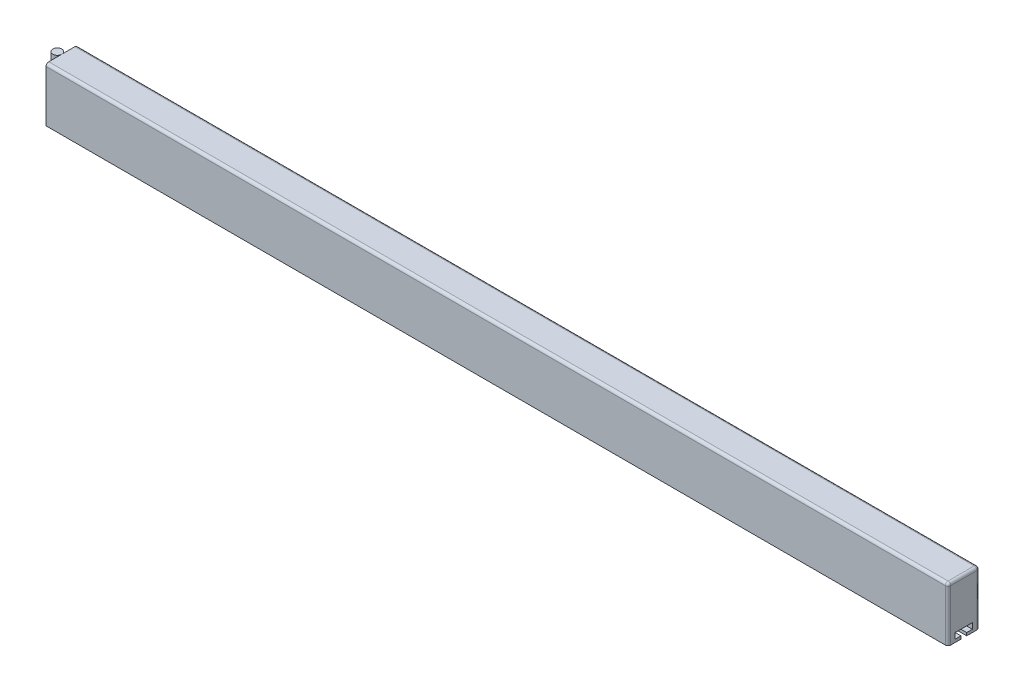
ISO-10303-21;
HEADER;
FILE_DESCRIPTION(('STEP AP214'),'2;1');
FILE_NAME('part.step','',(''),(''),'','','');
FILE_SCHEMA(('AUTOMOTIVE_DESIGN { 1 0 10303 214 1 1 1 1 }'));
ENDSEC;
DATA;
#1=APPLICATION_CONTEXT('core data for automotive mechanical design processes');
#2=APPLICATION_PROTOCOL_DEFINITION('international standard','automotive_design',2000,#1);
#3=PRODUCT_CONTEXT('',#1,'mechanical');
#4=PRODUCT('Part','Part','',(#3));
#5=PRODUCT_RELATED_PRODUCT_CATEGORY('part','',(#4));
#6=PRODUCT_DEFINITION_FORMATION('','',#4);
#7=PRODUCT_DEFINITION_CONTEXT('part definition',#1,'design');
#8=PRODUCT_DEFINITION('design','',#6,#7);
#9=PRODUCT_DEFINITION_SHAPE('','',#8);
#10=(LENGTH_UNIT() NAMED_UNIT(*) SI_UNIT(.MILLI.,.METRE.));
#11=(NAMED_UNIT(*) PLANE_ANGLE_UNIT() SI_UNIT($,.RADIAN.));
#12=(NAMED_UNIT(*) SI_UNIT($,.STERADIAN.) SOLID_ANGLE_UNIT());
#13=UNCERTAINTY_MEASURE_WITH_UNIT(LENGTH_MEASURE(1.E-05),#10,'distance_accuracy_value','');
#14=(GEOMETRIC_REPRESENTATION_CONTEXT(3) GLOBAL_UNCERTAINTY_ASSIGNED_CONTEXT((#13)) GLOBAL_UNIT_ASSIGNED_CONTEXT((#10,
#11,#12)) REPRESENTATION_CONTEXT('',''));
#15=CARTESIAN_POINT('',(0.,0.,0.));
#16=DIRECTION('',(0.,0.,1.));
#17=DIRECTION('',(1.,0.,0.));
#18=AXIS2_PLACEMENT_3D('',#15,#16,#17);
#19=CARTESIAN_POINT('',(-1010.,-88.284271247462,35.));
#20=DIRECTION('',(0.,1.,0.));
#21=DIRECTION('',(0.,0.,1.));
#22=AXIS2_PLACEMENT_3D('',#19,#20,#21);
#23=CYLINDRICAL_SURFACE('',#22,10.0000000000001);
#24=CARTESIAN_POINT('',(-1010.,-60.,35.));
#25=DIRECTION('',(0.,1.,0.));
#26=DIRECTION('',(0.,0.,1.));
#27=AXIS2_PLACEMENT_3D('',#24,#25,#26);
#28=CIRCLE('',#27,10.0000000000001);
#29=CARTESIAN_POINT('',(-1010.,-60.,45.0000000000001));
#30=VERTEX_POINT('',#29);
#31=EDGE_CURVE('E11',#30,#30,#28,.F.);
#32=ORIENTED_EDGE('',*,*,#31,.F.);
#33=EDGE_LOOP('',(#32));
#34=FACE_BOUND('',#33,.T.);
#35=CARTESIAN_POINT('',(-1010.,60.,35.));
#36=DIRECTION('',(0.,1.,0.));
#37=DIRECTION('',(0.,0.,1.));
#38=AXIS2_PLACEMENT_3D('',#35,#36,#37);
#39=CIRCLE('',#38,10.0000000000001);
#40=CARTESIAN_POINT('',(-1010.,60.,45.0000000000001));
#41=VERTEX_POINT('',#40);
#42=EDGE_CURVE('E48',#41,#41,#39,.T.);
#43=ORIENTED_EDGE('',*,*,#42,.F.);
#44=EDGE_LOOP('',(#43));
#45=FACE_BOUND('',#44,.T.);
#46=ADVANCED_FACE('F42',(#34,#45),#23,.T.);
#47=CARTESIAN_POINT('',(-1010.,60.,35.));
#48=DIRECTION('',(0.,1.,0.));
#49=DIRECTION('',(0.,0.,1.));
#50=AXIS2_PLACEMENT_3D('',#47,#48,#49);
#51=PLANE('',#50);
#52=ORIENTED_EDGE('',*,*,#42,.T.);
#53=EDGE_LOOP('',(#52));
#54=FACE_BOUND('',#53,.T.);
#55=ADVANCED_FACE('F54',(#54),#51,.T.);
#56=CARTESIAN_POINT('',(-1000.,-60.,70.));
#57=DIRECTION('',(0.,1.,0.));
#58=DIRECTION('',(0.,0.,1.));
#59=AXIS2_PLACEMENT_3D('',#56,#57,#58);
#60=PLANE('',#59);
#61=ORIENTED_EDGE('',*,*,#31,.T.);
#62=EDGE_LOOP('',(#61));
#63=FACE_BOUND('',#62,.T.);
#64=ADVANCED_FACE('F61',(#63),#60,.F.);
#65=CLOSED_SHELL('',(#46,#55,#64));
#66=MANIFOLD_SOLID_BREP('B2',#65);
#67=CARTESIAN_POINT('',(-1000.,-60.,70.));
#68=DIRECTION('',(0.,1.,0.));
#69=DIRECTION('',(0.,0.,1.));
#70=AXIS2_PLACEMENT_3D('',#67,#68,#69);
#71=PLANE('',#70);
#72=DIRECTION('',(0.,0.,-1.));
#73=VECTOR('',#72,1.);
#74=CARTESIAN_POINT('',(1000.,-60.,70.));
#75=LINE('',#74,#73);
#76=CARTESIAN_POINT('',(1000.,-60.,64.));
#77=VERTEX_POINT('',#76);
#78=CARTESIAN_POINT('',(1000.,-60.,41.35));
#79=VERTEX_POINT('',#78);
#80=EDGE_CURVE('E222',#77,#79,#75,.T.);
#81=ORIENTED_EDGE('',*,*,#80,.F.);
#82=CARTESIAN_POINT('',(994.,-60.,64.));
#83=DIRECTION('',(0.,1.,0.));
#84=DIRECTION('',(0.,0.,1.));
#85=AXIS2_PLACEMENT_3D('',#82,#83,#84);
#86=CIRCLE('',#85,6.);
#87=CARTESIAN_POINT('',(994.,-60.,70.));
#88=VERTEX_POINT('',#87);
#89=EDGE_CURVE('E40',#77,#88,#86,.F.);
#90=ORIENTED_EDGE('',*,*,#89,.T.);
#91=DIRECTION('',(1.,0.,0.));
#92=VECTOR('',#91,1.);
#93=CARTESIAN_POINT('',(-1000.,-60.,70.));
#94=LINE('',#93,#92);
#95=CARTESIAN_POINT('',(-1000.,-60.,70.));
#96=VERTEX_POINT('',#95);
#97=EDGE_CURVE('E223',#96,#88,#94,.T.);
#98=ORIENTED_EDGE('',*,*,#97,.F.);
#99=DIRECTION('',(0.,0.,-1.));
#100=VECTOR('',#99,1.);
#101=CARTESIAN_POINT('',(-1000.,-60.,70.));
#102=LINE('',#101,#100);
#103=CARTESIAN_POINT('',(-1000.,-60.,41.35));
#104=VERTEX_POINT('',#103);
#105=EDGE_CURVE('E232',#96,#104,#102,.T.);
#106=ORIENTED_EDGE('',*,*,#105,.T.);
#107=DIRECTION('',(1.,0.,0.));
#108=VECTOR('',#107,1.);
#109=CARTESIAN_POINT('',(-1042.59709497137,-60.,41.35));
#110=LINE('',#109,#108);
#111=EDGE_CURVE('E288',#104,#79,#110,.T.);
#112=ORIENTED_EDGE('',*,*,#111,.T.);
#113=EDGE_LOOP('',(#81,#90,#98,#106,#112));
#114=FACE_BOUND('',#113,.T.);
#115=ADVANCED_FACE('F79',(#114),#71,.F.);
#116=CARTESIAN_POINT('',(1000.,-60.,70.));
#117=DIRECTION('',(-1.,0.,0.));
#118=DIRECTION('',(0.,0.,1.));
#119=AXIS2_PLACEMENT_3D('',#116,#117,#118);
#120=PLANE('',#119);
#121=CARTESIAN_POINT('',(1000.,-60.,28.65));
#122=VERTEX_POINT('',#121);
#123=CARTESIAN_POINT('',(1000.,-60.,6.00000000000001));
#124=VERTEX_POINT('',#123);
#125=EDGE_CURVE('E212',#122,#124,#75,.T.);
#126=ORIENTED_EDGE('',*,*,#125,.T.);
#127=DIRECTION('',(0.,1.,0.));
#128=VECTOR('',#127,1.);
#129=CARTESIAN_POINT('',(1000.,54.,6.00000000000001));
#130=LINE('',#129,#128);
#131=CARTESIAN_POINT('',(1000.,54.,6.00000000000001));
#132=VERTEX_POINT('',#131);
#133=EDGE_CURVE('E256',#124,#132,#130,.T.);
#134=ORIENTED_EDGE('',*,*,#133,.T.);
#135=DIRECTION('',(0.,0.,-1.));
#136=VECTOR('',#135,1.);
#137=CARTESIAN_POINT('',(1000.,54.,70.));
#138=LINE('',#137,#136);
#139=CARTESIAN_POINT('',(1000.,54.,64.));
#140=VERTEX_POINT('',#139);
#141=EDGE_CURVE('E254',#132,#140,#138,.F.);
#142=ORIENTED_EDGE('',*,*,#141,.T.);
#143=DIRECTION('',(0.,1.,0.));
#144=VECTOR('',#143,1.);
#145=CARTESIAN_POINT('',(1000.,-60.,64.));
#146=LINE('',#145,#144);
#147=EDGE_CURVE('E252',#140,#77,#146,.F.);
#148=ORIENTED_EDGE('',*,*,#147,.T.);
#149=ORIENTED_EDGE('',*,*,#80,.T.);
#150=DIRECTION('',(0.,-1.,0.));
#151=VECTOR('',#150,1.);
#152=CARTESIAN_POINT('',(1000.,-60.,41.35));
#153=LINE('',#152,#151);
#154=CARTESIAN_POINT('',(1000.,-53.65,41.35));
#155=VERTEX_POINT('',#154);
#156=EDGE_CURVE('E206',#155,#79,#153,.T.);
#157=ORIENTED_EDGE('',*,*,#156,.F.);
#158=DIRECTION('',(0.,0.,-1.));
#159=VECTOR('',#158,1.);
#160=CARTESIAN_POINT('',(1000.,-53.65,41.35));
#161=LINE('',#160,#159);
#162=CARTESIAN_POINT('',(1000.,-53.65,54.05));
#163=VERTEX_POINT('',#162);
#164=EDGE_CURVE('E535',#163,#155,#161,.T.);
#165=ORIENTED_EDGE('',*,*,#164,.F.);
#166=DIRECTION('',(0.,-1.,0.));
#167=VECTOR('',#166,1.);
#168=CARTESIAN_POINT('',(1000.,-53.65,54.05));
#169=LINE('',#168,#167);
#170=CARTESIAN_POINT('',(1000.,-40.95,54.05));
#171=VERTEX_POINT('',#170);
#172=EDGE_CURVE('E533',#171,#163,#169,.T.);
#173=ORIENTED_EDGE('',*,*,#172,.F.);
#174=DIRECTION('',(0.,0.,1.));
#175=VECTOR('',#174,1.);
#176=CARTESIAN_POINT('',(1000.,-40.95,54.05));
#177=LINE('',#176,#175);
#178=CARTESIAN_POINT('',(1000.,-40.95,15.95));
#179=VERTEX_POINT('',#178);
#180=EDGE_CURVE('E530',#179,#171,#177,.T.);
#181=ORIENTED_EDGE('',*,*,#180,.F.);
#182=DIRECTION('',(0.,1.,0.));
#183=VECTOR('',#182,1.);
#184=CARTESIAN_POINT('',(1000.,-53.65,15.95));
#185=LINE('',#184,#183);
#186=CARTESIAN_POINT('',(1000.,-53.65,15.95));
#187=VERTEX_POINT('',#186);
#188=EDGE_CURVE('E527',#187,#179,#185,.T.);
#189=ORIENTED_EDGE('',*,*,#188,.F.);
#190=DIRECTION('',(0.,0.,-1.));
#191=VECTOR('',#190,1.);
#192=CARTESIAN_POINT('',(1000.,-53.65,28.65));
#193=LINE('',#192,#191);
#194=CARTESIAN_POINT('',(1000.,-53.65,28.65));
#195=VERTEX_POINT('',#194);
#196=EDGE_CURVE('E216',#195,#187,#193,.T.);
#197=ORIENTED_EDGE('',*,*,#196,.F.);
#198=DIRECTION('',(0.,1.,0.));
#199=VECTOR('',#198,1.);
#200=CARTESIAN_POINT('',(1000.,-60.,28.65));
#201=LINE('',#200,#199);
#202=EDGE_CURVE('E197',#122,#195,#201,.T.);
#203=ORIENTED_EDGE('',*,*,#202,.F.);
#204=EDGE_LOOP('',(#126,#134,#142,#148,#149,#157,#165,#173,#181,#189,#197,#203));
#205=FACE_BOUND('',#204,.T.);
#206=ADVANCED_FACE('F210',(#205),#120,.F.);
#207=CARTESIAN_POINT('',(-1000.,60.,70.));
#208=DIRECTION('',(0.,-1.,0.));
#209=DIRECTION('',(0.,0.,-1.));
#210=AXIS2_PLACEMENT_3D('',#207,#208,#209);
#211=PLANE('',#210);
#212=DIRECTION('',(-1.,0.,0.));
#213=VECTOR('',#212,1.);
#214=CARTESIAN_POINT('',(-1000.,60.,64.));
#215=LINE('',#214,#213);
#216=CARTESIAN_POINT('',(-1000.,60.,64.));
#217=VERTEX_POINT('',#216);
#218=CARTESIAN_POINT('',(994.,60.,64.));
#219=VERTEX_POINT('',#218);
#220=EDGE_CURVE('E238',#217,#219,#215,.F.);
#221=ORIENTED_EDGE('',*,*,#220,.T.);
#222=DIRECTION('',(0.,0.,-1.));
#223=VECTOR('',#222,1.);
#224=CARTESIAN_POINT('',(994.,60.,70.));
#225=LINE('',#224,#223);
#226=CARTESIAN_POINT('',(994.,60.,6.00000000000001));
#227=VERTEX_POINT('',#226);
#228=EDGE_CURVE('E263',#219,#227,#225,.T.);
#229=ORIENTED_EDGE('',*,*,#228,.T.);
#230=DIRECTION('',(-1.,0.,0.));
#231=VECTOR('',#230,1.);
#232=CARTESIAN_POINT('',(-1000.,60.,6.00000000000001));
#233=LINE('',#232,#231);
#234=CARTESIAN_POINT('',(-1000.,60.,6.00000000000001));
#235=VERTEX_POINT('',#234);
#236=EDGE_CURVE('E241',#227,#235,#233,.T.);
#237=ORIENTED_EDGE('',*,*,#236,.T.);
#238=DIRECTION('',(0.,0.,-1.));
#239=VECTOR('',#238,1.);
#240=CARTESIAN_POINT('',(-1000.,60.,70.));
#241=LINE('',#240,#239);
#242=EDGE_CURVE('E235',#217,#235,#241,.T.);
#243=ORIENTED_EDGE('',*,*,#242,.F.);
#244=EDGE_LOOP('',(#221,#229,#237,#243));
#245=FACE_BOUND('',#244,.T.);
#246=ADVANCED_FACE('F339',(#245),#211,.F.);
#247=CARTESIAN_POINT('',(-1000.,-60.,70.));
#248=DIRECTION('',(1.,0.,0.));
#249=DIRECTION('',(0.,0.,-1.));
#250=AXIS2_PLACEMENT_3D('',#247,#248,#249);
#251=PLANE('',#250);
#252=ORIENTED_EDGE('',*,*,#242,.T.);
#253=CARTESIAN_POINT('',(-1000.,54.,6.00000000000001));
#254=DIRECTION('',(1.,0.,0.));
#255=DIRECTION('',(0.,0.,-1.));
#256=AXIS2_PLACEMENT_3D('',#253,#254,#255);
#257=CIRCLE('',#256,6.);
#258=CARTESIAN_POINT('',(-1000.,54.,0.));
#259=VERTEX_POINT('',#258);
#260=EDGE_CURVE('E245',#235,#259,#257,.F.);
#261=ORIENTED_EDGE('',*,*,#260,.T.);
#262=DIRECTION('',(0.,-1.,0.));
#263=VECTOR('',#262,1.);
#264=CARTESIAN_POINT('',(-1000.,-60.,0.));
#265=LINE('',#264,#263);
#266=CARTESIAN_POINT('',(-1000.,-60.,0.));
#267=VERTEX_POINT('',#266);
#268=EDGE_CURVE('E311',#259,#267,#265,.T.);
#269=ORIENTED_EDGE('',*,*,#268,.T.);
#270=CARTESIAN_POINT('',(-1000.,-60.,28.65));
#271=VERTEX_POINT('',#270);
#272=EDGE_CURVE('E225',#271,#267,#102,.T.);
#273=ORIENTED_EDGE('',*,*,#272,.F.);
#274=DIRECTION('',(0.,-1.,0.));
#275=VECTOR('',#274,1.);
#276=CARTESIAN_POINT('',(-1000.,-60.,28.65));
#277=LINE('',#276,#275);
#278=CARTESIAN_POINT('',(-1000.,-53.65,28.65));
#279=VERTEX_POINT('',#278);
#280=EDGE_CURVE('E200',#279,#271,#277,.T.);
#281=ORIENTED_EDGE('',*,*,#280,.F.);
#282=DIRECTION('',(0.,0.,1.));
#283=VECTOR('',#282,1.);
#284=CARTESIAN_POINT('',(-1000.,-53.65,28.65));
#285=LINE('',#284,#283);
#286=CARTESIAN_POINT('',(-1000.,-53.65,15.95));
#287=VERTEX_POINT('',#286);
#288=EDGE_CURVE('E292',#287,#279,#285,.T.);
#289=ORIENTED_EDGE('',*,*,#288,.F.);
#290=DIRECTION('',(0.,-1.,0.));
#291=VECTOR('',#290,1.);
#292=CARTESIAN_POINT('',(-1000.,-53.65,15.95));
#293=LINE('',#292,#291);
#294=CARTESIAN_POINT('',(-1000.,-40.95,15.95));
#295=VERTEX_POINT('',#294);
#296=EDGE_CURVE('E295',#295,#287,#293,.T.);
#297=ORIENTED_EDGE('',*,*,#296,.F.);
#298=DIRECTION('',(0.,0.,-1.));
#299=VECTOR('',#298,1.);
#300=CARTESIAN_POINT('',(-1000.,-40.95,54.05));
#301=LINE('',#300,#299);
#302=CARTESIAN_POINT('',(-1000.,-40.95,54.05));
#303=VERTEX_POINT('',#302);
#304=EDGE_CURVE('E516',#303,#295,#301,.T.);
#305=ORIENTED_EDGE('',*,*,#304,.F.);
#306=DIRECTION('',(0.,1.,0.));
#307=VECTOR('',#306,1.);
#308=CARTESIAN_POINT('',(-1000.,-53.65,54.05));
#309=LINE('',#308,#307);
#310=CARTESIAN_POINT('',(-1000.,-53.65,54.05));
#311=VERTEX_POINT('',#310);
#312=EDGE_CURVE('E519',#311,#303,#309,.T.);
#313=ORIENTED_EDGE('',*,*,#312,.F.);
#314=DIRECTION('',(0.,0.,1.));
#315=VECTOR('',#314,1.);
#316=CARTESIAN_POINT('',(-1000.,-53.65,41.35));
#317=LINE('',#316,#315);
#318=CARTESIAN_POINT('',(-1000.,-53.65,41.35));
#319=VERTEX_POINT('',#318);
#320=EDGE_CURVE('E523',#319,#311,#317,.T.);
#321=ORIENTED_EDGE('',*,*,#320,.F.);
#322=DIRECTION('',(0.,1.,0.));
#323=VECTOR('',#322,1.);
#324=CARTESIAN_POINT('',(-1000.,-60.,41.35));
#325=LINE('',#324,#323);
#326=EDGE_CURVE('E312',#104,#319,#325,.T.);
#327=ORIENTED_EDGE('',*,*,#326,.F.);
#328=ORIENTED_EDGE('',*,*,#105,.F.);
#329=DIRECTION('',(0.,-1.,0.));
#330=VECTOR('',#329,1.);
#331=CARTESIAN_POINT('',(-1000.,-60.,70.));
#332=LINE('',#331,#330);
#333=CARTESIAN_POINT('',(-1000.,54.,70.));
#334=VERTEX_POINT('',#333);
#335=EDGE_CURVE('E226',#334,#96,#332,.T.);
#336=ORIENTED_EDGE('',*,*,#335,.F.);
#337=CARTESIAN_POINT('',(-1000.,54.,64.));
#338=DIRECTION('',(1.,0.,0.));
#339=DIRECTION('',(0.,0.,-1.));
#340=AXIS2_PLACEMENT_3D('',#337,#338,#339);
#341=CIRCLE('',#340,6.);
#342=EDGE_CURVE('E243',#334,#217,#341,.F.);
#343=ORIENTED_EDGE('',*,*,#342,.T.);
#344=EDGE_LOOP('',(#252,#261,#269,#273,#281,#289,#297,#305,#313,#321,#327,#328,#336,#343));
#345=FACE_BOUND('',#344,.T.);
#346=ADVANCED_FACE('F345',(#345),#251,.F.);
#347=DIRECTION('',(1.,0.,0.));
#348=VECTOR('',#347,1.);
#349=CARTESIAN_POINT('',(-1000.,-60.,0.));
#350=LINE('',#349,#348);
#351=CARTESIAN_POINT('',(994.,-60.,0.));
#352=VERTEX_POINT('',#351);
#353=EDGE_CURVE('E230',#267,#352,#350,.T.);
#354=ORIENTED_EDGE('',*,*,#353,.T.);
#355=CARTESIAN_POINT('',(994.,-60.,6.00000000000001));
#356=DIRECTION('',(0.,1.,0.));
#357=DIRECTION('',(0.,0.,1.));
#358=AXIS2_PLACEMENT_3D('',#355,#356,#357);
#359=CIRCLE('',#358,6.);
#360=EDGE_CURVE('E221',#352,#124,#359,.F.);
#361=ORIENTED_EDGE('',*,*,#360,.T.);
#362=ORIENTED_EDGE('',*,*,#125,.F.);
#363=DIRECTION('',(1.,0.,0.));
#364=VECTOR('',#363,1.);
#365=CARTESIAN_POINT('',(-1042.59709497137,-60.,28.65));
#366=LINE('',#365,#364);
#367=EDGE_CURVE('E193',#271,#122,#366,.T.);
#368=ORIENTED_EDGE('',*,*,#367,.F.);
#369=ORIENTED_EDGE('',*,*,#272,.T.);
#370=EDGE_LOOP('',(#354,#361,#362,#368,#369));
#371=FACE_BOUND('',#370,.T.);
#372=ADVANCED_FACE('F219',(#371),#71,.F.);
#373=CARTESIAN_POINT('',(0.,0.,70.));
#374=DIRECTION('',(0.,0.,-1.));
#375=DIRECTION('',(-1.,0.,0.));
#376=AXIS2_PLACEMENT_3D('',#373,#374,#375);
#377=PLANE('',#376);
#378=ORIENTED_EDGE('',*,*,#97,.T.);
#379=DIRECTION('',(0.,1.,0.));
#380=VECTOR('',#379,1.);
#381=CARTESIAN_POINT('',(994.,0.,70.));
#382=LINE('',#381,#380);
#383=CARTESIAN_POINT('',(994.,54.,70.));
#384=VERTEX_POINT('',#383);
#385=EDGE_CURVE('E88',#88,#384,#382,.T.);
#386=ORIENTED_EDGE('',*,*,#385,.T.);
#387=DIRECTION('',(-1.,0.,0.));
#388=VECTOR('',#387,1.);
#389=CARTESIAN_POINT('',(0.,54.,70.));
#390=LINE('',#389,#388);
#391=EDGE_CURVE('E250',#384,#334,#390,.T.);
#392=ORIENTED_EDGE('',*,*,#391,.T.);
#393=ORIENTED_EDGE('',*,*,#335,.T.);
#394=EDGE_LOOP('',(#378,#386,#392,#393));
#395=FACE_BOUND('',#394,.T.);
#396=ADVANCED_FACE('F344',(#395),#377,.F.);
#397=CARTESIAN_POINT('',(0.,0.,0.));
#398=DIRECTION('',(0.,0.,-1.));
#399=DIRECTION('',(-1.,0.,0.));
#400=AXIS2_PLACEMENT_3D('',#397,#398,#399);
#401=PLANE('',#400);
#402=DIRECTION('',(-1.,0.,0.));
#403=VECTOR('',#402,1.);
#404=CARTESIAN_POINT('',(1000.,54.,0.));
#405=LINE('',#404,#403);
#406=CARTESIAN_POINT('',(994.,54.,0.));
#407=VERTEX_POINT('',#406);
#408=EDGE_CURVE('E247',#259,#407,#405,.F.);
#409=ORIENTED_EDGE('',*,*,#408,.T.);
#410=DIRECTION('',(0.,1.,0.));
#411=VECTOR('',#410,1.);
#412=CARTESIAN_POINT('',(994.,-60.,0.));
#413=LINE('',#412,#411);
#414=EDGE_CURVE('E258',#407,#352,#413,.F.);
#415=ORIENTED_EDGE('',*,*,#414,.T.);
#416=ORIENTED_EDGE('',*,*,#353,.F.);
#417=ORIENTED_EDGE('',*,*,#268,.F.);
#418=EDGE_LOOP('',(#409,#415,#416,#417));
#419=FACE_BOUND('',#418,.T.);
#420=ADVANCED_FACE('F350',(#419),#401,.T.);
#421=CARTESIAN_POINT('',(-1042.59709497137,-60.,41.35));
#422=DIRECTION('',(0.,0.,1.));
#423=DIRECTION('',(1.,0.,0.));
#424=AXIS2_PLACEMENT_3D('',#421,#422,#423);
#425=PLANE('',#424);
#426=ORIENTED_EDGE('',*,*,#326,.T.);
#427=DIRECTION('',(1.,0.,0.));
#428=VECTOR('',#427,1.);
#429=CARTESIAN_POINT('',(-1042.59709497137,-53.65,41.35));
#430=LINE('',#429,#428);
#431=EDGE_CURVE('E293',#319,#155,#430,.T.);
#432=ORIENTED_EDGE('',*,*,#431,.T.);
#433=ORIENTED_EDGE('',*,*,#156,.T.);
#434=ORIENTED_EDGE('',*,*,#111,.F.);
#435=EDGE_LOOP('',(#426,#432,#433,#434));
#436=FACE_BOUND('',#435,.T.);
#437=ADVANCED_FACE('F413',(#436),#425,.F.);
#438=CARTESIAN_POINT('',(-1042.59709497137,-53.65,41.35));
#439=DIRECTION('',(0.,-1.,0.));
#440=DIRECTION('',(0.,0.,-1.));
#441=AXIS2_PLACEMENT_3D('',#438,#439,#440);
#442=PLANE('',#441);
#443=ORIENTED_EDGE('',*,*,#320,.T.);
#444=DIRECTION('',(1.,0.,0.));
#445=VECTOR('',#444,1.);
#446=CARTESIAN_POINT('',(-1042.59709497137,-53.65,54.05));
#447=LINE('',#446,#445);
#448=EDGE_CURVE('E297',#311,#163,#447,.T.);
#449=ORIENTED_EDGE('',*,*,#448,.T.);
#450=ORIENTED_EDGE('',*,*,#164,.T.);
#451=ORIENTED_EDGE('',*,*,#431,.F.);
#452=EDGE_LOOP('',(#443,#449,#450,#451));
#453=FACE_BOUND('',#452,.T.);
#454=ADVANCED_FACE('F454',(#453),#442,.F.);
#455=CARTESIAN_POINT('',(-1042.59709497137,-53.65,54.05));
#456=DIRECTION('',(0.,0.,1.));
#457=DIRECTION('',(1.,0.,0.));
#458=AXIS2_PLACEMENT_3D('',#455,#456,#457);
#459=PLANE('',#458);
#460=ORIENTED_EDGE('',*,*,#312,.T.);
#461=DIRECTION('',(1.,0.,0.));
#462=VECTOR('',#461,1.);
#463=CARTESIAN_POINT('',(-1042.59709497137,-40.95,54.05));
#464=LINE('',#463,#462);
#465=EDGE_CURVE('E303',#303,#171,#464,.T.);
#466=ORIENTED_EDGE('',*,*,#465,.T.);
#467=ORIENTED_EDGE('',*,*,#172,.T.);
#468=ORIENTED_EDGE('',*,*,#448,.F.);
#469=EDGE_LOOP('',(#460,#466,#467,#468));
#470=FACE_BOUND('',#469,.T.);
#471=ADVANCED_FACE('F462',(#470),#459,.F.);
#472=CARTESIAN_POINT('',(-1042.59709497137,-40.95,54.05));
#473=DIRECTION('',(0.,1.,0.));
#474=DIRECTION('',(0.,0.,1.));
#475=AXIS2_PLACEMENT_3D('',#472,#473,#474);
#476=PLANE('',#475);
#477=ORIENTED_EDGE('',*,*,#304,.T.);
#478=DIRECTION('',(1.,0.,0.));
#479=VECTOR('',#478,1.);
#480=CARTESIAN_POINT('',(-1042.59709497137,-40.95,15.95));
#481=LINE('',#480,#479);
#482=EDGE_CURVE('E305',#295,#179,#481,.T.);
#483=ORIENTED_EDGE('',*,*,#482,.T.);
#484=ORIENTED_EDGE('',*,*,#180,.T.);
#485=ORIENTED_EDGE('',*,*,#465,.F.);
#486=EDGE_LOOP('',(#477,#483,#484,#485));
#487=FACE_BOUND('',#486,.T.);
#488=ADVANCED_FACE('F471',(#487),#476,.F.);
#489=CARTESIAN_POINT('',(-1042.59709497137,-53.65,15.95));
#490=DIRECTION('',(0.,0.,-1.));
#491=DIRECTION('',(-1.,0.,0.));
#492=AXIS2_PLACEMENT_3D('',#489,#490,#491);
#493=PLANE('',#492);
#494=ORIENTED_EDGE('',*,*,#296,.T.);
#495=DIRECTION('',(1.,0.,0.));
#496=VECTOR('',#495,1.);
#497=CARTESIAN_POINT('',(-1042.59709497137,-53.65,15.95));
#498=LINE('',#497,#496);
#499=EDGE_CURVE('E307',#287,#187,#498,.T.);
#500=ORIENTED_EDGE('',*,*,#499,.T.);
#501=ORIENTED_EDGE('',*,*,#188,.T.);
#502=ORIENTED_EDGE('',*,*,#482,.F.);
#503=EDGE_LOOP('',(#494,#500,#501,#502));
#504=FACE_BOUND('',#503,.T.);
#505=ADVANCED_FACE('F480',(#504),#493,.F.);
#506=CARTESIAN_POINT('',(-1042.59709497137,-53.65,28.65));
#507=DIRECTION('',(0.,-1.,0.));
#508=DIRECTION('',(0.,0.,-1.));
#509=AXIS2_PLACEMENT_3D('',#506,#507,#508);
#510=PLANE('',#509);
#511=ORIENTED_EDGE('',*,*,#288,.T.);
#512=DIRECTION('',(1.,0.,0.));
#513=VECTOR('',#512,1.);
#514=CARTESIAN_POINT('',(-1042.59709497137,-53.65,28.65));
#515=LINE('',#514,#513);
#516=EDGE_CURVE('E205',#279,#195,#515,.T.);
#517=ORIENTED_EDGE('',*,*,#516,.T.);
#518=ORIENTED_EDGE('',*,*,#196,.T.);
#519=ORIENTED_EDGE('',*,*,#499,.F.);
#520=EDGE_LOOP('',(#511,#517,#518,#519));
#521=FACE_BOUND('',#520,.T.);
#522=ADVANCED_FACE('F489',(#521),#510,.F.);
#523=CARTESIAN_POINT('',(-1042.59709497137,-60.,28.65));
#524=DIRECTION('',(0.,0.,-1.));
#525=DIRECTION('',(-1.,0.,0.));
#526=AXIS2_PLACEMENT_3D('',#523,#524,#525);
#527=PLANE('',#526);
#528=ORIENTED_EDGE('',*,*,#280,.T.);
#529=ORIENTED_EDGE('',*,*,#367,.T.);
#530=ORIENTED_EDGE('',*,*,#202,.T.);
#531=ORIENTED_EDGE('',*,*,#516,.F.);
#532=EDGE_LOOP('',(#528,#529,#530,#531));
#533=FACE_BOUND('',#532,.T.);
#534=ADVANCED_FACE('F195',(#533),#527,.F.);
#535=CARTESIAN_POINT('',(-1000.,54.,6.00000000000001));
#536=DIRECTION('',(1.,0.,0.));
#537=DIRECTION('',(0.,0.,-1.));
#538=AXIS2_PLACEMENT_3D('',#535,#536,#537);
#539=CYLINDRICAL_SURFACE('',#538,6.);
#540=ORIENTED_EDGE('',*,*,#236,.F.);
#541=CARTESIAN_POINT('',(994.,54.,6.00000000000001));
#542=DIRECTION('',(1.,0.,0.));
#543=DIRECTION('',(0.,0.,-1.));
#544=AXIS2_PLACEMENT_3D('',#541,#542,#543);
#545=CIRCLE('',#544,6.);
#546=EDGE_CURVE('E261',#227,#407,#545,.F.);
#547=ORIENTED_EDGE('',*,*,#546,.T.);
#548=ORIENTED_EDGE('',*,*,#408,.F.);
#549=ORIENTED_EDGE('',*,*,#260,.F.);
#550=EDGE_LOOP('',(#540,#547,#548,#549));
#551=FACE_BOUND('',#550,.T.);
#552=ADVANCED_FACE('F358',(#551),#539,.T.);
#553=CARTESIAN_POINT('',(0.,54.,64.));
#554=DIRECTION('',(-1.,0.,0.));
#555=DIRECTION('',(0.,0.,1.));
#556=AXIS2_PLACEMENT_3D('',#553,#554,#555);
#557=CYLINDRICAL_SURFACE('',#556,6.);
#558=ORIENTED_EDGE('',*,*,#391,.F.);
#559=CARTESIAN_POINT('',(994.,54.,64.));
#560=DIRECTION('',(-1.,0.,0.));
#561=DIRECTION('',(0.,0.,1.));
#562=AXIS2_PLACEMENT_3D('',#559,#560,#561);
#563=CIRCLE('',#562,6.);
#564=EDGE_CURVE('E265',#384,#219,#563,.T.);
#565=ORIENTED_EDGE('',*,*,#564,.T.);
#566=ORIENTED_EDGE('',*,*,#220,.F.);
#567=ORIENTED_EDGE('',*,*,#342,.F.);
#568=EDGE_LOOP('',(#558,#565,#566,#567));
#569=FACE_BOUND('',#568,.T.);
#570=ADVANCED_FACE('F361',(#569),#557,.T.);
#571=CARTESIAN_POINT('',(994.,0.,64.));
#572=DIRECTION('',(0.,1.,0.));
#573=DIRECTION('',(0.,0.,1.));
#574=AXIS2_PLACEMENT_3D('',#571,#572,#573);
#575=CYLINDRICAL_SURFACE('',#574,6.);
#576=CARTESIAN_POINT('',(994.,54.,64.));
#577=DIRECTION('',(0.,1.,0.));
#578=DIRECTION('',(0.,0.,1.));
#579=AXIS2_PLACEMENT_3D('',#576,#577,#578);
#580=CIRCLE('',#579,6.);
#581=EDGE_CURVE('E83',#384,#140,#580,.T.);
#582=ORIENTED_EDGE('',*,*,#581,.F.);
#583=ORIENTED_EDGE('',*,*,#385,.F.);
#584=ORIENTED_EDGE('',*,*,#89,.F.);
#585=ORIENTED_EDGE('',*,*,#147,.F.);
#586=EDGE_LOOP('',(#582,#583,#584,#585));
#587=FACE_BOUND('',#586,.T.);
#588=ADVANCED_FACE('F81',(#587),#575,.T.);
#589=CARTESIAN_POINT('',(994.,54.,64.));
#590=DIRECTION('',(-1.,0.,0.));
#591=DIRECTION('',(0.,0.,1.));
#592=AXIS2_PLACEMENT_3D('',#589,#590,#591);
#593=SPHERICAL_SURFACE('',#592,6.);
#594=ORIENTED_EDGE('',*,*,#564,.F.);
#595=ORIENTED_EDGE('',*,*,#581,.T.);
#596=CARTESIAN_POINT('',(994.,54.,64.));
#597=DIRECTION('',(0.,0.,-1.));
#598=DIRECTION('',(-1.,0.,0.));
#599=AXIS2_PLACEMENT_3D('',#596,#597,#598);
#600=CIRCLE('',#599,6.);
#601=EDGE_CURVE('E272',#219,#140,#600,.T.);
#602=ORIENTED_EDGE('',*,*,#601,.F.);
#603=EDGE_LOOP('',(#594,#595,#602));
#604=FACE_BOUND('',#603,.T.);
#605=ADVANCED_FACE('F282',(#604),#593,.T.);
#606=CARTESIAN_POINT('',(994.,54.,70.));
#607=DIRECTION('',(0.,0.,-1.));
#608=DIRECTION('',(-1.,0.,0.));
#609=AXIS2_PLACEMENT_3D('',#606,#607,#608);
#610=CYLINDRICAL_SURFACE('',#609,6.);
#611=CARTESIAN_POINT('',(994.,54.,6.00000000000001));
#612=DIRECTION('',(0.,0.,-1.));
#613=DIRECTION('',(-1.,0.,0.));
#614=AXIS2_PLACEMENT_3D('',#611,#612,#613);
#615=CIRCLE('',#614,6.);
#616=EDGE_CURVE('E270',#227,#132,#615,.T.);
#617=ORIENTED_EDGE('',*,*,#616,.F.);
#618=ORIENTED_EDGE('',*,*,#228,.F.);
#619=ORIENTED_EDGE('',*,*,#601,.T.);
#620=ORIENTED_EDGE('',*,*,#141,.F.);
#621=EDGE_LOOP('',(#617,#618,#619,#620));
#622=FACE_BOUND('',#621,.T.);
#623=ADVANCED_FACE('F325',(#622),#610,.T.);
#624=CARTESIAN_POINT('',(994.,54.,6.00000000000001));
#625=DIRECTION('',(-1.,0.,0.));
#626=DIRECTION('',(0.,0.,1.));
#627=AXIS2_PLACEMENT_3D('',#624,#625,#626);
#628=SPHERICAL_SURFACE('',#627,6.);
#629=ORIENTED_EDGE('',*,*,#546,.F.);
#630=ORIENTED_EDGE('',*,*,#616,.T.);
#631=CARTESIAN_POINT('',(994.,54.,6.00000000000001));
#632=DIRECTION('',(0.,-1.,0.));
#633=DIRECTION('',(0.,0.,-1.));
#634=AXIS2_PLACEMENT_3D('',#631,#632,#633);
#635=CIRCLE('',#634,6.);
#636=EDGE_CURVE('E268',#407,#132,#635,.T.);
#637=ORIENTED_EDGE('',*,*,#636,.F.);
#638=EDGE_LOOP('',(#629,#630,#637));
#639=FACE_BOUND('',#638,.T.);
#640=ADVANCED_FACE('F324',(#639),#628,.T.);
#641=CARTESIAN_POINT('',(994.,-60.,6.00000000000001));
#642=DIRECTION('',(0.,-1.,0.));
#643=DIRECTION('',(0.,0.,-1.));
#644=AXIS2_PLACEMENT_3D('',#641,#642,#643);
#645=CYLINDRICAL_SURFACE('',#644,6.);
#646=ORIENTED_EDGE('',*,*,#360,.F.);
#647=ORIENTED_EDGE('',*,*,#414,.F.);
#648=ORIENTED_EDGE('',*,*,#636,.T.);
#649=ORIENTED_EDGE('',*,*,#133,.F.);
#650=EDGE_LOOP('',(#646,#647,#648,#649));
#651=FACE_BOUND('',#650,.T.);
#652=ADVANCED_FACE('F319',(#651),#645,.T.);
#653=CLOSED_SHELL('',(#115,#206,#246,#346,#372,#396,#420,#437,#454,#471,#488,#505,#522,#534,
#552,#570,#588,#605,#623,#640,#652));
#654=MANIFOLD_SOLID_BREP('B6',#653);
#655=ADVANCED_BREP_SHAPE_REPRESENTATION('',(#18,#66,#654),#14);
#656=SHAPE_DEFINITION_REPRESENTATION(#9,#655);
ENDSEC;
END-ISO-10303-21;
